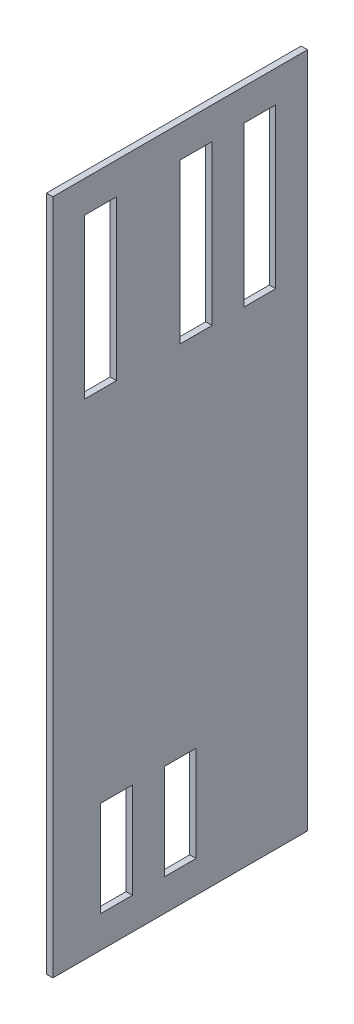
ISO-10303-21;
HEADER;
FILE_DESCRIPTION(('STEP AP214'),'2;1');
FILE_NAME('part.step','',(''),(''),'','','');
FILE_SCHEMA(('AUTOMOTIVE_DESIGN { 1 0 10303 214 1 1 1 1 }'));
ENDSEC;
DATA;
#1=APPLICATION_CONTEXT('core data for automotive mechanical design processes');
#2=APPLICATION_PROTOCOL_DEFINITION('international standard','automotive_design',2000,#1);
#3=PRODUCT_CONTEXT('',#1,'mechanical');
#4=PRODUCT('Part','Part','',(#3));
#5=PRODUCT_RELATED_PRODUCT_CATEGORY('part','',(#4));
#6=PRODUCT_DEFINITION_FORMATION('','',#4);
#7=PRODUCT_DEFINITION_CONTEXT('part definition',#1,'design');
#8=PRODUCT_DEFINITION('design','',#6,#7);
#9=PRODUCT_DEFINITION_SHAPE('','',#8);
#10=(LENGTH_UNIT() NAMED_UNIT(*) SI_UNIT(.MILLI.,.METRE.));
#11=(NAMED_UNIT(*) PLANE_ANGLE_UNIT() SI_UNIT($,.RADIAN.));
#12=(NAMED_UNIT(*) SI_UNIT($,.STERADIAN.) SOLID_ANGLE_UNIT());
#13=UNCERTAINTY_MEASURE_WITH_UNIT(LENGTH_MEASURE(1.E-05),#10,'distance_accuracy_value','');
#14=(GEOMETRIC_REPRESENTATION_CONTEXT(3) GLOBAL_UNCERTAINTY_ASSIGNED_CONTEXT((#13)) GLOBAL_UNIT_ASSIGNED_CONTEXT((#10,
#11,#12)) REPRESENTATION_CONTEXT('',''));
#15=CARTESIAN_POINT('',(0.,0.,0.));
#16=DIRECTION('',(0.,0.,1.));
#17=DIRECTION('',(1.,0.,0.));
#18=AXIS2_PLACEMENT_3D('',#15,#16,#17);
#19=CARTESIAN_POINT('',(-2.,0.,0.));
#20=DIRECTION('',(0.,0.,-1.));
#21=DIRECTION('',(-1.,0.,0.));
#22=AXIS2_PLACEMENT_3D('',#19,#20,#21);
#23=PLANE('',#22);
#24=DIRECTION('',(0.,1.,0.));
#25=VECTOR('',#24,1.);
#26=CARTESIAN_POINT('',(0.,0.,0.));
#27=LINE('',#26,#25);
#28=CARTESIAN_POINT('',(0.,0.,0.));
#29=VERTEX_POINT('',#28);
#30=CARTESIAN_POINT('',(0.,212.4467896,0.));
#31=VERTEX_POINT('',#30);
#32=EDGE_CURVE('E355',#29,#31,#27,.T.);
#33=ORIENTED_EDGE('',*,*,#32,.F.);
#34=DIRECTION('',(1.,0.,0.));
#35=VECTOR('',#34,1.);
#36=CARTESIAN_POINT('',(-2.,0.,0.));
#37=LINE('',#36,#35);
#38=CARTESIAN_POINT('',(-2.,0.,0.));
#39=VERTEX_POINT('',#38);
#40=EDGE_CURVE('E11',#39,#29,#37,.T.);
#41=ORIENTED_EDGE('',*,*,#40,.F.);
#42=DIRECTION('',(0.,1.,0.));
#43=VECTOR('',#42,1.);
#44=CARTESIAN_POINT('',(-2.,0.,0.));
#45=LINE('',#44,#43);
#46=CARTESIAN_POINT('',(-2.,212.4467896,0.));
#47=VERTEX_POINT('',#46);
#48=EDGE_CURVE('E362',#39,#47,#45,.T.);
#49=ORIENTED_EDGE('',*,*,#48,.T.);
#50=DIRECTION('',(1.,0.,0.));
#51=VECTOR('',#50,1.);
#52=CARTESIAN_POINT('',(-2.,212.4467896,0.));
#53=LINE('',#52,#51);
#54=EDGE_CURVE('E39',#47,#31,#53,.T.);
#55=ORIENTED_EDGE('',*,*,#54,.T.);
#56=EDGE_LOOP('',(#33,#41,#49,#55));
#57=FACE_BOUND('',#56,.T.);
#58=ADVANCED_FACE('F36',(#57),#23,.T.);
#59=CARTESIAN_POINT('',(-2.,0.,0.));
#60=DIRECTION('',(0.,-1.,0.));
#61=DIRECTION('',(0.,0.,-1.));
#62=AXIS2_PLACEMENT_3D('',#59,#60,#61);
#63=PLANE('',#62);
#64=DIRECTION('',(0.,0.,-1.));
#65=VECTOR('',#64,1.);
#66=CARTESIAN_POINT('',(0.,0.,0.));
#67=LINE('',#66,#65);
#68=CARTESIAN_POINT('',(0.,0.,80.));
#69=VERTEX_POINT('',#68);
#70=EDGE_CURVE('E366',#69,#29,#67,.T.);
#71=ORIENTED_EDGE('',*,*,#70,.F.);
#72=DIRECTION('',(1.,0.,0.));
#73=VECTOR('',#72,1.);
#74=CARTESIAN_POINT('',(-2.,0.,80.));
#75=LINE('',#74,#73);
#76=CARTESIAN_POINT('',(-2.,0.,80.));
#77=VERTEX_POINT('',#76);
#78=EDGE_CURVE('E44',#77,#69,#75,.T.);
#79=ORIENTED_EDGE('',*,*,#78,.F.);
#80=DIRECTION('',(0.,0.,-1.));
#81=VECTOR('',#80,1.);
#82=CARTESIAN_POINT('',(-2.,0.,0.));
#83=LINE('',#82,#81);
#84=EDGE_CURVE('E372',#77,#39,#83,.T.);
#85=ORIENTED_EDGE('',*,*,#84,.T.);
#86=ORIENTED_EDGE('',*,*,#40,.T.);
#87=EDGE_LOOP('',(#71,#79,#85,#86));
#88=FACE_BOUND('',#87,.T.);
#89=ADVANCED_FACE('F398',(#88),#63,.T.);
#90=CARTESIAN_POINT('',(-2.,0.,80.));
#91=DIRECTION('',(0.,0.,1.));
#92=DIRECTION('',(1.,0.,0.));
#93=AXIS2_PLACEMENT_3D('',#90,#91,#92);
#94=PLANE('',#93);
#95=DIRECTION('',(0.,-1.,0.));
#96=VECTOR('',#95,1.);
#97=CARTESIAN_POINT('',(0.,0.,80.));
#98=LINE('',#97,#96);
#99=CARTESIAN_POINT('',(0.,212.4467896,80.));
#100=VERTEX_POINT('',#99);
#101=EDGE_CURVE('E380',#100,#69,#98,.T.);
#102=ORIENTED_EDGE('',*,*,#101,.F.);
#103=DIRECTION('',(1.,0.,0.));
#104=VECTOR('',#103,1.);
#105=CARTESIAN_POINT('',(-2.,212.4467896,80.));
#106=LINE('',#105,#104);
#107=CARTESIAN_POINT('',(-2.,212.4467896,80.));
#108=VERTEX_POINT('',#107);
#109=EDGE_CURVE('E385',#108,#100,#106,.T.);
#110=ORIENTED_EDGE('',*,*,#109,.F.);
#111=DIRECTION('',(0.,-1.,0.));
#112=VECTOR('',#111,1.);
#113=CARTESIAN_POINT('',(-2.,0.,80.));
#114=LINE('',#113,#112);
#115=EDGE_CURVE('E369',#108,#77,#114,.T.);
#116=ORIENTED_EDGE('',*,*,#115,.T.);
#117=ORIENTED_EDGE('',*,*,#78,.T.);
#118=EDGE_LOOP('',(#102,#110,#116,#117));
#119=FACE_BOUND('',#118,.T.);
#120=ADVANCED_FACE('F403',(#119),#94,.T.);
#121=CARTESIAN_POINT('',(-2.,212.4467896,0.));
#122=DIRECTION('',(0.,1.,0.));
#123=DIRECTION('',(0.,0.,1.));
#124=AXIS2_PLACEMENT_3D('',#121,#122,#123);
#125=PLANE('',#124);
#126=DIRECTION('',(0.,0.,1.));
#127=VECTOR('',#126,1.);
#128=CARTESIAN_POINT('',(0.,212.4467896,0.));
#129=LINE('',#128,#127);
#130=EDGE_CURVE('E377',#31,#100,#129,.T.);
#131=ORIENTED_EDGE('',*,*,#130,.F.);
#132=ORIENTED_EDGE('',*,*,#54,.F.);
#133=DIRECTION('',(0.,0.,1.));
#134=VECTOR('',#133,1.);
#135=CARTESIAN_POINT('',(-2.,212.4467896,0.));
#136=LINE('',#135,#134);
#137=EDGE_CURVE('E365',#47,#108,#136,.T.);
#138=ORIENTED_EDGE('',*,*,#137,.T.);
#139=ORIENTED_EDGE('',*,*,#109,.T.);
#140=EDGE_LOOP('',(#131,#132,#138,#139));
#141=FACE_BOUND('',#140,.T.);
#142=ADVANCED_FACE('F393',(#141),#125,.T.);
#143=CARTESIAN_POINT('',(-2.,0.,0.));
#144=DIRECTION('',(1.,0.,0.));
#145=DIRECTION('',(0.,0.,-1.));
#146=AXIS2_PLACEMENT_3D('',#143,#144,#145);
#147=PLANE('',#146);
#148=DIRECTION('',(0.,0.,1.));
#149=VECTOR('',#148,1.);
#150=CARTESIAN_POINT('',(-2.,40.,45.));
#151=LINE('',#150,#149);
#152=CARTESIAN_POINT('',(-2.,40.,35.));
#153=VERTEX_POINT('',#152);
#154=CARTESIAN_POINT('',(-2.,40.,45.));
#155=VERTEX_POINT('',#154);
#156=EDGE_CURVE('E205',#153,#155,#151,.T.);
#157=ORIENTED_EDGE('',*,*,#156,.T.);
#158=DIRECTION('',(0.,-1.,0.));
#159=VECTOR('',#158,1.);
#160=CARTESIAN_POINT('',(-2.,40.,45.));
#161=LINE('',#160,#159);
#162=CARTESIAN_POINT('',(-2.,9.99999999999999,45.));
#163=VERTEX_POINT('',#162);
#164=EDGE_CURVE('E199',#155,#163,#161,.T.);
#165=ORIENTED_EDGE('',*,*,#164,.T.);
#166=DIRECTION('',(0.,0.,-1.));
#167=VECTOR('',#166,1.);
#168=CARTESIAN_POINT('',(-2.,9.99999999999999,45.));
#169=LINE('',#168,#167);
#170=CARTESIAN_POINT('',(-2.,9.99999999999999,35.));
#171=VERTEX_POINT('',#170);
#172=EDGE_CURVE('E208',#163,#171,#169,.T.);
#173=ORIENTED_EDGE('',*,*,#172,.T.);
#174=DIRECTION('',(0.,1.,0.));
#175=VECTOR('',#174,1.);
#176=CARTESIAN_POINT('',(-2.,40.,35.));
#177=LINE('',#176,#175);
#178=EDGE_CURVE('E52',#171,#153,#177,.T.);
#179=ORIENTED_EDGE('',*,*,#178,.T.);
#180=EDGE_LOOP('',(#157,#165,#173,#179));
#181=FACE_BOUND('',#180,.T.);
#182=DIRECTION('',(0.,0.,1.));
#183=VECTOR('',#182,1.);
#184=CARTESIAN_POINT('',(-2.,40.,65.));
#185=LINE('',#184,#183);
#186=CARTESIAN_POINT('',(-2.,40.,55.));
#187=VERTEX_POINT('',#186);
#188=CARTESIAN_POINT('',(-2.,40.,65.));
#189=VERTEX_POINT('',#188);
#190=EDGE_CURVE('E244',#187,#189,#185,.T.);
#191=ORIENTED_EDGE('',*,*,#190,.T.);
#192=DIRECTION('',(0.,-1.,0.));
#193=VECTOR('',#192,1.);
#194=CARTESIAN_POINT('',(-2.,40.,65.));
#195=LINE('',#194,#193);
#196=CARTESIAN_POINT('',(-2.,9.99999999999999,65.));
#197=VERTEX_POINT('',#196);
#198=EDGE_CURVE('E234',#189,#197,#195,.T.);
#199=ORIENTED_EDGE('',*,*,#198,.T.);
#200=DIRECTION('',(0.,0.,-1.));
#201=VECTOR('',#200,1.);
#202=CARTESIAN_POINT('',(-2.,9.99999999999999,65.));
#203=LINE('',#202,#201);
#204=CARTESIAN_POINT('',(-2.,9.99999999999999,55.));
#205=VERTEX_POINT('',#204);
#206=EDGE_CURVE('E237',#197,#205,#203,.T.);
#207=ORIENTED_EDGE('',*,*,#206,.T.);
#208=DIRECTION('',(0.,1.,0.));
#209=VECTOR('',#208,1.);
#210=CARTESIAN_POINT('',(-2.,40.,55.));
#211=LINE('',#210,#209);
#212=EDGE_CURVE('E241',#205,#187,#211,.T.);
#213=ORIENTED_EDGE('',*,*,#212,.T.);
#214=EDGE_LOOP('',(#191,#199,#207,#213));
#215=FACE_BOUND('',#214,.T.);
#216=DIRECTION('',(0.,0.,1.));
#217=VECTOR('',#216,1.);
#218=CARTESIAN_POINT('',(-2.,202.4467896,20.));
#219=LINE('',#218,#217);
#220=CARTESIAN_POINT('',(-2.,202.4467896,10.));
#221=VERTEX_POINT('',#220);
#222=CARTESIAN_POINT('',(-2.,202.4467896,20.));
#223=VERTEX_POINT('',#222);
#224=EDGE_CURVE('E276',#221,#223,#219,.T.);
#225=ORIENTED_EDGE('',*,*,#224,.T.);
#226=DIRECTION('',(0.,-1.,0.));
#227=VECTOR('',#226,1.);
#228=CARTESIAN_POINT('',(-2.,202.4467896,20.));
#229=LINE('',#228,#227);
#230=CARTESIAN_POINT('',(-2.,152.4467896,20.));
#231=VERTEX_POINT('',#230);
#232=EDGE_CURVE('E266',#223,#231,#229,.T.);
#233=ORIENTED_EDGE('',*,*,#232,.T.);
#234=DIRECTION('',(0.,0.,-1.));
#235=VECTOR('',#234,1.);
#236=CARTESIAN_POINT('',(-2.,152.4467896,20.));
#237=LINE('',#236,#235);
#238=CARTESIAN_POINT('',(-2.,152.4467896,10.));
#239=VERTEX_POINT('',#238);
#240=EDGE_CURVE('E269',#231,#239,#237,.T.);
#241=ORIENTED_EDGE('',*,*,#240,.T.);
#242=DIRECTION('',(0.,1.,0.));
#243=VECTOR('',#242,1.);
#244=CARTESIAN_POINT('',(-2.,202.4467896,10.));
#245=LINE('',#244,#243);
#246=EDGE_CURVE('E273',#239,#221,#245,.T.);
#247=ORIENTED_EDGE('',*,*,#246,.T.);
#248=EDGE_LOOP('',(#225,#233,#241,#247));
#249=FACE_BOUND('',#248,.T.);
#250=DIRECTION('',(0.,0.,1.));
#251=VECTOR('',#250,1.);
#252=CARTESIAN_POINT('',(-2.,202.4467896,40.));
#253=LINE('',#252,#251);
#254=CARTESIAN_POINT('',(-2.,202.4467896,30.));
#255=VERTEX_POINT('',#254);
#256=CARTESIAN_POINT('',(-2.,202.4467896,40.));
#257=VERTEX_POINT('',#256);
#258=EDGE_CURVE('E308',#255,#257,#253,.T.);
#259=ORIENTED_EDGE('',*,*,#258,.T.);
#260=DIRECTION('',(0.,-1.,0.));
#261=VECTOR('',#260,1.);
#262=CARTESIAN_POINT('',(-2.,202.4467896,40.));
#263=LINE('',#262,#261);
#264=CARTESIAN_POINT('',(-2.,152.4467896,40.));
#265=VERTEX_POINT('',#264);
#266=EDGE_CURVE('E298',#257,#265,#263,.T.);
#267=ORIENTED_EDGE('',*,*,#266,.T.);
#268=DIRECTION('',(0.,0.,-1.));
#269=VECTOR('',#268,1.);
#270=CARTESIAN_POINT('',(-2.,152.4467896,40.));
#271=LINE('',#270,#269);
#272=CARTESIAN_POINT('',(-2.,152.4467896,30.));
#273=VERTEX_POINT('',#272);
#274=EDGE_CURVE('E301',#265,#273,#271,.T.);
#275=ORIENTED_EDGE('',*,*,#274,.T.);
#276=DIRECTION('',(0.,1.,0.));
#277=VECTOR('',#276,1.);
#278=CARTESIAN_POINT('',(-2.,202.4467896,30.));
#279=LINE('',#278,#277);
#280=EDGE_CURVE('E305',#273,#255,#279,.T.);
#281=ORIENTED_EDGE('',*,*,#280,.T.);
#282=EDGE_LOOP('',(#259,#267,#275,#281));
#283=FACE_BOUND('',#282,.T.);
#284=DIRECTION('',(0.,0.,1.));
#285=VECTOR('',#284,1.);
#286=CARTESIAN_POINT('',(-2.,202.4467896,70.));
#287=LINE('',#286,#285);
#288=CARTESIAN_POINT('',(-2.,202.4467896,60.));
#289=VERTEX_POINT('',#288);
#290=CARTESIAN_POINT('',(-2.,202.4467896,70.));
#291=VERTEX_POINT('',#290);
#292=EDGE_CURVE('E340',#289,#291,#287,.T.);
#293=ORIENTED_EDGE('',*,*,#292,.T.);
#294=DIRECTION('',(0.,-1.,0.));
#295=VECTOR('',#294,1.);
#296=CARTESIAN_POINT('',(-2.,202.4467896,70.));
#297=LINE('',#296,#295);
#298=CARTESIAN_POINT('',(-2.,152.4467896,70.));
#299=VERTEX_POINT('',#298);
#300=EDGE_CURVE('E330',#291,#299,#297,.T.);
#301=ORIENTED_EDGE('',*,*,#300,.T.);
#302=DIRECTION('',(0.,0.,-1.));
#303=VECTOR('',#302,1.);
#304=CARTESIAN_POINT('',(-2.,152.4467896,70.));
#305=LINE('',#304,#303);
#306=CARTESIAN_POINT('',(-2.,152.4467896,60.));
#307=VERTEX_POINT('',#306);
#308=EDGE_CURVE('E333',#299,#307,#305,.T.);
#309=ORIENTED_EDGE('',*,*,#308,.T.);
#310=DIRECTION('',(0.,1.,0.));
#311=VECTOR('',#310,1.);
#312=CARTESIAN_POINT('',(-2.,202.4467896,60.));
#313=LINE('',#312,#311);
#314=EDGE_CURVE('E337',#307,#289,#313,.T.);
#315=ORIENTED_EDGE('',*,*,#314,.T.);
#316=EDGE_LOOP('',(#293,#301,#309,#315));
#317=FACE_BOUND('',#316,.T.);
#318=ORIENTED_EDGE('',*,*,#48,.F.);
#319=ORIENTED_EDGE('',*,*,#84,.F.);
#320=ORIENTED_EDGE('',*,*,#115,.F.);
#321=ORIENTED_EDGE('',*,*,#137,.F.);
#322=EDGE_LOOP('',(#318,#319,#320,#321));
#323=FACE_BOUND('',#322,.T.);
#324=ADVANCED_FACE('F212',(#181,#215,#249,#283,#317,#323),#147,.F.);
#325=CARTESIAN_POINT('',(0.,0.,0.));
#326=DIRECTION('',(1.,0.,0.));
#327=DIRECTION('',(0.,0.,-1.));
#328=AXIS2_PLACEMENT_3D('',#325,#326,#327);
#329=PLANE('',#328);
#330=DIRECTION('',(0.,-1.,0.));
#331=VECTOR('',#330,1.);
#332=CARTESIAN_POINT('',(0.,40.,45.));
#333=LINE('',#332,#331);
#334=CARTESIAN_POINT('',(0.,40.,45.));
#335=VERTEX_POINT('',#334);
#336=CARTESIAN_POINT('',(0.,9.99999999999999,45.));
#337=VERTEX_POINT('',#336);
#338=EDGE_CURVE('E60',#335,#337,#333,.T.);
#339=ORIENTED_EDGE('',*,*,#338,.F.);
#340=DIRECTION('',(0.,0.,1.));
#341=VECTOR('',#340,1.);
#342=CARTESIAN_POINT('',(0.,40.,45.));
#343=LINE('',#342,#341);
#344=CARTESIAN_POINT('',(0.,40.,35.));
#345=VERTEX_POINT('',#344);
#346=EDGE_CURVE('E215',#345,#335,#343,.T.);
#347=ORIENTED_EDGE('',*,*,#346,.F.);
#348=DIRECTION('',(0.,1.,0.));
#349=VECTOR('',#348,1.);
#350=CARTESIAN_POINT('',(0.,40.,35.));
#351=LINE('',#350,#349);
#352=CARTESIAN_POINT('',(0.,9.99999999999999,35.));
#353=VERTEX_POINT('',#352);
#354=EDGE_CURVE('E218',#353,#345,#351,.T.);
#355=ORIENTED_EDGE('',*,*,#354,.F.);
#356=DIRECTION('',(0.,0.,-1.));
#357=VECTOR('',#356,1.);
#358=CARTESIAN_POINT('',(0.,9.99999999999999,45.));
#359=LINE('',#358,#357);
#360=EDGE_CURVE('E224',#337,#353,#359,.T.);
#361=ORIENTED_EDGE('',*,*,#360,.F.);
#362=EDGE_LOOP('',(#339,#347,#355,#361));
#363=FACE_BOUND('',#362,.T.);
#364=DIRECTION('',(0.,-1.,0.));
#365=VECTOR('',#364,1.);
#366=CARTESIAN_POINT('',(0.,40.,65.));
#367=LINE('',#366,#365);
#368=CARTESIAN_POINT('',(0.,40.,65.));
#369=VERTEX_POINT('',#368);
#370=CARTESIAN_POINT('',(0.,9.99999999999999,65.));
#371=VERTEX_POINT('',#370);
#372=EDGE_CURVE('E230',#369,#371,#367,.T.);
#373=ORIENTED_EDGE('',*,*,#372,.F.);
#374=DIRECTION('',(0.,0.,1.));
#375=VECTOR('',#374,1.);
#376=CARTESIAN_POINT('',(0.,40.,65.));
#377=LINE('',#376,#375);
#378=CARTESIAN_POINT('',(0.,40.,55.));
#379=VERTEX_POINT('',#378);
#380=EDGE_CURVE('E238',#379,#369,#377,.T.);
#381=ORIENTED_EDGE('',*,*,#380,.F.);
#382=DIRECTION('',(0.,1.,0.));
#383=VECTOR('',#382,1.);
#384=CARTESIAN_POINT('',(0.,40.,55.));
#385=LINE('',#384,#383);
#386=CARTESIAN_POINT('',(0.,9.99999999999999,55.));
#387=VERTEX_POINT('',#386);
#388=EDGE_CURVE('E252',#387,#379,#385,.T.);
#389=ORIENTED_EDGE('',*,*,#388,.F.);
#390=DIRECTION('',(0.,0.,-1.));
#391=VECTOR('',#390,1.);
#392=CARTESIAN_POINT('',(0.,9.99999999999999,65.));
#393=LINE('',#392,#391);
#394=EDGE_CURVE('E249',#371,#387,#393,.T.);
#395=ORIENTED_EDGE('',*,*,#394,.F.);
#396=EDGE_LOOP('',(#373,#381,#389,#395));
#397=FACE_BOUND('',#396,.T.);
#398=DIRECTION('',(0.,-1.,0.));
#399=VECTOR('',#398,1.);
#400=CARTESIAN_POINT('',(0.,202.4467896,20.));
#401=LINE('',#400,#399);
#402=CARTESIAN_POINT('',(0.,202.4467896,20.));
#403=VERTEX_POINT('',#402);
#404=CARTESIAN_POINT('',(0.,152.4467896,20.));
#405=VERTEX_POINT('',#404);
#406=EDGE_CURVE('E259',#403,#405,#401,.T.);
#407=ORIENTED_EDGE('',*,*,#406,.F.);
#408=DIRECTION('',(0.,0.,1.));
#409=VECTOR('',#408,1.);
#410=CARTESIAN_POINT('',(0.,202.4467896,20.));
#411=LINE('',#410,#409);
#412=CARTESIAN_POINT('',(0.,202.4467896,10.));
#413=VERTEX_POINT('',#412);
#414=EDGE_CURVE('E270',#413,#403,#411,.T.);
#415=ORIENTED_EDGE('',*,*,#414,.F.);
#416=DIRECTION('',(0.,1.,0.));
#417=VECTOR('',#416,1.);
#418=CARTESIAN_POINT('',(0.,202.4467896,10.));
#419=LINE('',#418,#417);
#420=CARTESIAN_POINT('',(0.,152.4467896,10.));
#421=VERTEX_POINT('',#420);
#422=EDGE_CURVE('E284',#421,#413,#419,.T.);
#423=ORIENTED_EDGE('',*,*,#422,.F.);
#424=DIRECTION('',(0.,0.,-1.));
#425=VECTOR('',#424,1.);
#426=CARTESIAN_POINT('',(0.,152.4467896,20.));
#427=LINE('',#426,#425);
#428=EDGE_CURVE('E281',#405,#421,#427,.T.);
#429=ORIENTED_EDGE('',*,*,#428,.F.);
#430=EDGE_LOOP('',(#407,#415,#423,#429));
#431=FACE_BOUND('',#430,.T.);
#432=DIRECTION('',(0.,-1.,0.));
#433=VECTOR('',#432,1.);
#434=CARTESIAN_POINT('',(0.,202.4467896,40.));
#435=LINE('',#434,#433);
#436=CARTESIAN_POINT('',(0.,202.4467896,40.));
#437=VERTEX_POINT('',#436);
#438=CARTESIAN_POINT('',(0.,152.4467896,40.));
#439=VERTEX_POINT('',#438);
#440=EDGE_CURVE('E291',#437,#439,#435,.T.);
#441=ORIENTED_EDGE('',*,*,#440,.F.);
#442=DIRECTION('',(0.,0.,1.));
#443=VECTOR('',#442,1.);
#444=CARTESIAN_POINT('',(0.,202.4467896,40.));
#445=LINE('',#444,#443);
#446=CARTESIAN_POINT('',(0.,202.4467896,30.));
#447=VERTEX_POINT('',#446);
#448=EDGE_CURVE('E302',#447,#437,#445,.T.);
#449=ORIENTED_EDGE('',*,*,#448,.F.);
#450=DIRECTION('',(0.,1.,0.));
#451=VECTOR('',#450,1.);
#452=CARTESIAN_POINT('',(0.,202.4467896,30.));
#453=LINE('',#452,#451);
#454=CARTESIAN_POINT('',(0.,152.4467896,30.));
#455=VERTEX_POINT('',#454);
#456=EDGE_CURVE('E316',#455,#447,#453,.T.);
#457=ORIENTED_EDGE('',*,*,#456,.F.);
#458=DIRECTION('',(0.,0.,-1.));
#459=VECTOR('',#458,1.);
#460=CARTESIAN_POINT('',(0.,152.4467896,40.));
#461=LINE('',#460,#459);
#462=EDGE_CURVE('E313',#439,#455,#461,.T.);
#463=ORIENTED_EDGE('',*,*,#462,.F.);
#464=EDGE_LOOP('',(#441,#449,#457,#463));
#465=FACE_BOUND('',#464,.T.);
#466=DIRECTION('',(0.,-1.,0.));
#467=VECTOR('',#466,1.);
#468=CARTESIAN_POINT('',(0.,202.4467896,70.));
#469=LINE('',#468,#467);
#470=CARTESIAN_POINT('',(0.,202.4467896,70.));
#471=VERTEX_POINT('',#470);
#472=CARTESIAN_POINT('',(0.,152.4467896,70.));
#473=VERTEX_POINT('',#472);
#474=EDGE_CURVE('E323',#471,#473,#469,.T.);
#475=ORIENTED_EDGE('',*,*,#474,.F.);
#476=DIRECTION('',(0.,0.,1.));
#477=VECTOR('',#476,1.);
#478=CARTESIAN_POINT('',(0.,202.4467896,70.));
#479=LINE('',#478,#477);
#480=CARTESIAN_POINT('',(0.,202.4467896,60.));
#481=VERTEX_POINT('',#480);
#482=EDGE_CURVE('E334',#481,#471,#479,.T.);
#483=ORIENTED_EDGE('',*,*,#482,.F.);
#484=DIRECTION('',(0.,1.,0.));
#485=VECTOR('',#484,1.);
#486=CARTESIAN_POINT('',(0.,202.4467896,60.));
#487=LINE('',#486,#485);
#488=CARTESIAN_POINT('',(0.,152.4467896,60.));
#489=VERTEX_POINT('',#488);
#490=EDGE_CURVE('E348',#489,#481,#487,.T.);
#491=ORIENTED_EDGE('',*,*,#490,.F.);
#492=DIRECTION('',(0.,0.,-1.));
#493=VECTOR('',#492,1.);
#494=CARTESIAN_POINT('',(0.,152.4467896,70.));
#495=LINE('',#494,#493);
#496=EDGE_CURVE('E345',#473,#489,#495,.T.);
#497=ORIENTED_EDGE('',*,*,#496,.F.);
#498=EDGE_LOOP('',(#475,#483,#491,#497));
#499=FACE_BOUND('',#498,.T.);
#500=ORIENTED_EDGE('',*,*,#32,.T.);
#501=ORIENTED_EDGE('',*,*,#130,.T.);
#502=ORIENTED_EDGE('',*,*,#101,.T.);
#503=ORIENTED_EDGE('',*,*,#70,.T.);
#504=EDGE_LOOP('',(#500,#501,#502,#503));
#505=FACE_BOUND('',#504,.T.);
#506=ADVANCED_FACE('F395',(#363,#397,#431,#465,#499,#505),#329,.T.);
#507=CARTESIAN_POINT('',(-2.,202.4467896,70.));
#508=DIRECTION('',(0.,0.,1.));
#509=DIRECTION('',(1.,0.,0.));
#510=AXIS2_PLACEMENT_3D('',#507,#508,#509);
#511=PLANE('',#510);
#512=ORIENTED_EDGE('',*,*,#474,.T.);
#513=DIRECTION('',(1.,0.,0.));
#514=VECTOR('',#513,1.);
#515=CARTESIAN_POINT('',(-2.,152.4467896,70.));
#516=LINE('',#515,#514);
#517=EDGE_CURVE('E343',#299,#473,#516,.T.);
#518=ORIENTED_EDGE('',*,*,#517,.F.);
#519=ORIENTED_EDGE('',*,*,#300,.F.);
#520=DIRECTION('',(1.,0.,0.));
#521=VECTOR('',#520,1.);
#522=CARTESIAN_POINT('',(-2.,202.4467896,70.));
#523=LINE('',#522,#521);
#524=EDGE_CURVE('E353',#291,#471,#523,.T.);
#525=ORIENTED_EDGE('',*,*,#524,.T.);
#526=EDGE_LOOP('',(#512,#518,#519,#525));
#527=FACE_BOUND('',#526,.T.);
#528=ADVANCED_FACE('F449',(#527),#511,.F.);
#529=CARTESIAN_POINT('',(-2.,202.4467896,70.));
#530=DIRECTION('',(0.,1.,0.));
#531=DIRECTION('',(0.,0.,1.));
#532=AXIS2_PLACEMENT_3D('',#529,#530,#531);
#533=PLANE('',#532);
#534=ORIENTED_EDGE('',*,*,#482,.T.);
#535=ORIENTED_EDGE('',*,*,#524,.F.);
#536=ORIENTED_EDGE('',*,*,#292,.F.);
#537=DIRECTION('',(1.,0.,0.));
#538=VECTOR('',#537,1.);
#539=CARTESIAN_POINT('',(-2.,202.4467896,60.));
#540=LINE('',#539,#538);
#541=EDGE_CURVE('E356',#289,#481,#540,.T.);
#542=ORIENTED_EDGE('',*,*,#541,.T.);
#543=EDGE_LOOP('',(#534,#535,#536,#542));
#544=FACE_BOUND('',#543,.T.);
#545=ADVANCED_FACE('F460',(#544),#533,.F.);
#546=CARTESIAN_POINT('',(-2.,202.4467896,60.));
#547=DIRECTION('',(0.,0.,-1.));
#548=DIRECTION('',(0.,1.,0.));
#549=AXIS2_PLACEMENT_3D('',#546,#547,#548);
#550=PLANE('',#549);
#551=ORIENTED_EDGE('',*,*,#490,.T.);
#552=ORIENTED_EDGE('',*,*,#541,.F.);
#553=ORIENTED_EDGE('',*,*,#314,.F.);
#554=DIRECTION('',(1.,0.,0.));
#555=VECTOR('',#554,1.);
#556=CARTESIAN_POINT('',(-2.,152.4467896,60.));
#557=LINE('',#556,#555);
#558=EDGE_CURVE('E358',#307,#489,#557,.T.);
#559=ORIENTED_EDGE('',*,*,#558,.T.);
#560=EDGE_LOOP('',(#551,#552,#553,#559));
#561=FACE_BOUND('',#560,.T.);
#562=ADVANCED_FACE('F471',(#561),#550,.F.);
#563=CARTESIAN_POINT('',(-2.,152.4467896,70.));
#564=DIRECTION('',(0.,-1.,0.));
#565=DIRECTION('',(0.,0.,-1.));
#566=AXIS2_PLACEMENT_3D('',#563,#564,#565);
#567=PLANE('',#566);
#568=ORIENTED_EDGE('',*,*,#496,.T.);
#569=ORIENTED_EDGE('',*,*,#558,.F.);
#570=ORIENTED_EDGE('',*,*,#308,.F.);
#571=ORIENTED_EDGE('',*,*,#517,.T.);
#572=EDGE_LOOP('',(#568,#569,#570,#571));
#573=FACE_BOUND('',#572,.T.);
#574=ADVANCED_FACE('F482',(#573),#567,.F.);
#575=CARTESIAN_POINT('',(-2.,202.4467896,40.));
#576=DIRECTION('',(0.,0.,1.));
#577=DIRECTION('',(0.,-1.,0.));
#578=AXIS2_PLACEMENT_3D('',#575,#576,#577);
#579=PLANE('',#578);
#580=ORIENTED_EDGE('',*,*,#440,.T.);
#581=DIRECTION('',(1.,0.,0.));
#582=VECTOR('',#581,1.);
#583=CARTESIAN_POINT('',(-2.,152.4467896,40.));
#584=LINE('',#583,#582);
#585=EDGE_CURVE('E311',#265,#439,#584,.T.);
#586=ORIENTED_EDGE('',*,*,#585,.F.);
#587=ORIENTED_EDGE('',*,*,#266,.F.);
#588=DIRECTION('',(1.,0.,0.));
#589=VECTOR('',#588,1.);
#590=CARTESIAN_POINT('',(-2.,202.4467896,40.));
#591=LINE('',#590,#589);
#592=EDGE_CURVE('E321',#257,#437,#591,.T.);
#593=ORIENTED_EDGE('',*,*,#592,.T.);
#594=EDGE_LOOP('',(#580,#586,#587,#593));
#595=FACE_BOUND('',#594,.T.);
#596=ADVANCED_FACE('F493',(#595),#579,.F.);
#597=CARTESIAN_POINT('',(-2.,202.4467896,40.));
#598=DIRECTION('',(0.,1.,0.));
#599=DIRECTION('',(0.,0.,1.));
#600=AXIS2_PLACEMENT_3D('',#597,#598,#599);
#601=PLANE('',#600);
#602=ORIENTED_EDGE('',*,*,#448,.T.);
#603=ORIENTED_EDGE('',*,*,#592,.F.);
#604=ORIENTED_EDGE('',*,*,#258,.F.);
#605=DIRECTION('',(1.,0.,0.));
#606=VECTOR('',#605,1.);
#607=CARTESIAN_POINT('',(-2.,202.4467896,30.));
#608=LINE('',#607,#606);
#609=EDGE_CURVE('E324',#255,#447,#608,.T.);
#610=ORIENTED_EDGE('',*,*,#609,.T.);
#611=EDGE_LOOP('',(#602,#603,#604,#610));
#612=FACE_BOUND('',#611,.T.);
#613=ADVANCED_FACE('F504',(#612),#601,.F.);
#614=CARTESIAN_POINT('',(-2.,202.4467896,30.));
#615=DIRECTION('',(0.,0.,-1.));
#616=DIRECTION('',(0.,1.,0.));
#617=AXIS2_PLACEMENT_3D('',#614,#615,#616);
#618=PLANE('',#617);
#619=ORIENTED_EDGE('',*,*,#456,.T.);
#620=ORIENTED_EDGE('',*,*,#609,.F.);
#621=ORIENTED_EDGE('',*,*,#280,.F.);
#622=DIRECTION('',(1.,0.,0.));
#623=VECTOR('',#622,1.);
#624=CARTESIAN_POINT('',(-2.,152.4467896,30.));
#625=LINE('',#624,#623);
#626=EDGE_CURVE('E326',#273,#455,#625,.T.);
#627=ORIENTED_EDGE('',*,*,#626,.T.);
#628=EDGE_LOOP('',(#619,#620,#621,#627));
#629=FACE_BOUND('',#628,.T.);
#630=ADVANCED_FACE('F515',(#629),#618,.F.);
#631=CARTESIAN_POINT('',(-2.,152.4467896,40.));
#632=DIRECTION('',(0.,-1.,0.));
#633=DIRECTION('',(0.,0.,-1.));
#634=AXIS2_PLACEMENT_3D('',#631,#632,#633);
#635=PLANE('',#634);
#636=ORIENTED_EDGE('',*,*,#462,.T.);
#637=ORIENTED_EDGE('',*,*,#626,.F.);
#638=ORIENTED_EDGE('',*,*,#274,.F.);
#639=ORIENTED_EDGE('',*,*,#585,.T.);
#640=EDGE_LOOP('',(#636,#637,#638,#639));
#641=FACE_BOUND('',#640,.T.);
#642=ADVANCED_FACE('F526',(#641),#635,.F.);
#643=CARTESIAN_POINT('',(-2.,202.4467896,20.));
#644=DIRECTION('',(0.,0.,1.));
#645=DIRECTION('',(0.,-1.,0.));
#646=AXIS2_PLACEMENT_3D('',#643,#644,#645);
#647=PLANE('',#646);
#648=ORIENTED_EDGE('',*,*,#406,.T.);
#649=DIRECTION('',(1.,0.,0.));
#650=VECTOR('',#649,1.);
#651=CARTESIAN_POINT('',(-2.,152.4467896,20.));
#652=LINE('',#651,#650);
#653=EDGE_CURVE('E279',#231,#405,#652,.T.);
#654=ORIENTED_EDGE('',*,*,#653,.F.);
#655=ORIENTED_EDGE('',*,*,#232,.F.);
#656=DIRECTION('',(1.,0.,0.));
#657=VECTOR('',#656,1.);
#658=CARTESIAN_POINT('',(-2.,202.4467896,20.));
#659=LINE('',#658,#657);
#660=EDGE_CURVE('E289',#223,#403,#659,.T.);
#661=ORIENTED_EDGE('',*,*,#660,.T.);
#662=EDGE_LOOP('',(#648,#654,#655,#661));
#663=FACE_BOUND('',#662,.T.);
#664=ADVANCED_FACE('F537',(#663),#647,.F.);
#665=CARTESIAN_POINT('',(-2.,202.4467896,20.));
#666=DIRECTION('',(0.,1.,0.));
#667=DIRECTION('',(0.,0.,1.));
#668=AXIS2_PLACEMENT_3D('',#665,#666,#667);
#669=PLANE('',#668);
#670=ORIENTED_EDGE('',*,*,#414,.T.);
#671=ORIENTED_EDGE('',*,*,#660,.F.);
#672=ORIENTED_EDGE('',*,*,#224,.F.);
#673=DIRECTION('',(1.,0.,0.));
#674=VECTOR('',#673,1.);
#675=CARTESIAN_POINT('',(-2.,202.4467896,10.));
#676=LINE('',#675,#674);
#677=EDGE_CURVE('E292',#221,#413,#676,.T.);
#678=ORIENTED_EDGE('',*,*,#677,.T.);
#679=EDGE_LOOP('',(#670,#671,#672,#678));
#680=FACE_BOUND('',#679,.T.);
#681=ADVANCED_FACE('F548',(#680),#669,.F.);
#682=CARTESIAN_POINT('',(-2.,202.4467896,10.));
#683=DIRECTION('',(0.,0.,-1.));
#684=DIRECTION('',(0.,1.,0.));
#685=AXIS2_PLACEMENT_3D('',#682,#683,#684);
#686=PLANE('',#685);
#687=ORIENTED_EDGE('',*,*,#422,.T.);
#688=ORIENTED_EDGE('',*,*,#677,.F.);
#689=ORIENTED_EDGE('',*,*,#246,.F.);
#690=DIRECTION('',(1.,0.,0.));
#691=VECTOR('',#690,1.);
#692=CARTESIAN_POINT('',(-2.,152.4467896,10.));
#693=LINE('',#692,#691);
#694=EDGE_CURVE('E294',#239,#421,#693,.T.);
#695=ORIENTED_EDGE('',*,*,#694,.T.);
#696=EDGE_LOOP('',(#687,#688,#689,#695));
#697=FACE_BOUND('',#696,.T.);
#698=ADVANCED_FACE('F559',(#697),#686,.F.);
#699=CARTESIAN_POINT('',(-2.,152.4467896,20.));
#700=DIRECTION('',(0.,-1.,0.));
#701=DIRECTION('',(0.,0.,-1.));
#702=AXIS2_PLACEMENT_3D('',#699,#700,#701);
#703=PLANE('',#702);
#704=ORIENTED_EDGE('',*,*,#428,.T.);
#705=ORIENTED_EDGE('',*,*,#694,.F.);
#706=ORIENTED_EDGE('',*,*,#240,.F.);
#707=ORIENTED_EDGE('',*,*,#653,.T.);
#708=EDGE_LOOP('',(#704,#705,#706,#707));
#709=FACE_BOUND('',#708,.T.);
#710=ADVANCED_FACE('F570',(#709),#703,.F.);
#711=CARTESIAN_POINT('',(-2.,40.,65.));
#712=DIRECTION('',(0.,0.,1.));
#713=DIRECTION('',(1.,0.,0.));
#714=AXIS2_PLACEMENT_3D('',#711,#712,#713);
#715=PLANE('',#714);
#716=ORIENTED_EDGE('',*,*,#372,.T.);
#717=DIRECTION('',(1.,0.,0.));
#718=VECTOR('',#717,1.);
#719=CARTESIAN_POINT('',(-2.,9.99999999999999,65.));
#720=LINE('',#719,#718);
#721=EDGE_CURVE('E247',#197,#371,#720,.T.);
#722=ORIENTED_EDGE('',*,*,#721,.F.);
#723=ORIENTED_EDGE('',*,*,#198,.F.);
#724=DIRECTION('',(1.,0.,0.));
#725=VECTOR('',#724,1.);
#726=CARTESIAN_POINT('',(-2.,40.,65.));
#727=LINE('',#726,#725);
#728=EDGE_CURVE('E257',#189,#369,#727,.T.);
#729=ORIENTED_EDGE('',*,*,#728,.T.);
#730=EDGE_LOOP('',(#716,#722,#723,#729));
#731=FACE_BOUND('',#730,.T.);
#732=ADVANCED_FACE('F581',(#731),#715,.F.);
#733=CARTESIAN_POINT('',(-2.,40.,65.));
#734=DIRECTION('',(0.,1.,0.));
#735=DIRECTION('',(0.,0.,1.));
#736=AXIS2_PLACEMENT_3D('',#733,#734,#735);
#737=PLANE('',#736);
#738=ORIENTED_EDGE('',*,*,#380,.T.);
#739=ORIENTED_EDGE('',*,*,#728,.F.);
#740=ORIENTED_EDGE('',*,*,#190,.F.);
#741=DIRECTION('',(1.,0.,0.));
#742=VECTOR('',#741,1.);
#743=CARTESIAN_POINT('',(-2.,40.,55.));
#744=LINE('',#743,#742);
#745=EDGE_CURVE('E260',#187,#379,#744,.T.);
#746=ORIENTED_EDGE('',*,*,#745,.T.);
#747=EDGE_LOOP('',(#738,#739,#740,#746));
#748=FACE_BOUND('',#747,.T.);
#749=ADVANCED_FACE('F592',(#748),#737,.F.);
#750=CARTESIAN_POINT('',(-2.,40.,55.));
#751=DIRECTION('',(0.,0.,-1.));
#752=DIRECTION('',(0.,1.,0.));
#753=AXIS2_PLACEMENT_3D('',#750,#751,#752);
#754=PLANE('',#753);
#755=ORIENTED_EDGE('',*,*,#388,.T.);
#756=ORIENTED_EDGE('',*,*,#745,.F.);
#757=ORIENTED_EDGE('',*,*,#212,.F.);
#758=DIRECTION('',(1.,0.,0.));
#759=VECTOR('',#758,1.);
#760=CARTESIAN_POINT('',(-2.,9.99999999999999,55.));
#761=LINE('',#760,#759);
#762=EDGE_CURVE('E262',#205,#387,#761,.T.);
#763=ORIENTED_EDGE('',*,*,#762,.T.);
#764=EDGE_LOOP('',(#755,#756,#757,#763));
#765=FACE_BOUND('',#764,.T.);
#766=ADVANCED_FACE('F603',(#765),#754,.F.);
#767=CARTESIAN_POINT('',(-2.,9.99999999999999,65.));
#768=DIRECTION('',(0.,-1.,0.));
#769=DIRECTION('',(0.,0.,-1.));
#770=AXIS2_PLACEMENT_3D('',#767,#768,#769);
#771=PLANE('',#770);
#772=ORIENTED_EDGE('',*,*,#394,.T.);
#773=ORIENTED_EDGE('',*,*,#762,.F.);
#774=ORIENTED_EDGE('',*,*,#206,.F.);
#775=ORIENTED_EDGE('',*,*,#721,.T.);
#776=EDGE_LOOP('',(#772,#773,#774,#775));
#777=FACE_BOUND('',#776,.T.);
#778=ADVANCED_FACE('F614',(#777),#771,.F.);
#779=CARTESIAN_POINT('',(-2.,40.,45.));
#780=DIRECTION('',(0.,0.,1.));
#781=DIRECTION('',(0.,-1.,0.));
#782=AXIS2_PLACEMENT_3D('',#779,#780,#781);
#783=PLANE('',#782);
#784=ORIENTED_EDGE('',*,*,#338,.T.);
#785=DIRECTION('',(1.,0.,0.));
#786=VECTOR('',#785,1.);
#787=CARTESIAN_POINT('',(-2.,9.99999999999999,45.));
#788=LINE('',#787,#786);
#789=EDGE_CURVE('E195',#163,#337,#788,.T.);
#790=ORIENTED_EDGE('',*,*,#789,.F.);
#791=ORIENTED_EDGE('',*,*,#164,.F.);
#792=DIRECTION('',(1.,0.,0.));
#793=VECTOR('',#792,1.);
#794=CARTESIAN_POINT('',(-2.,40.,45.));
#795=LINE('',#794,#793);
#796=EDGE_CURVE('E228',#155,#335,#795,.T.);
#797=ORIENTED_EDGE('',*,*,#796,.T.);
#798=EDGE_LOOP('',(#784,#790,#791,#797));
#799=FACE_BOUND('',#798,.T.);
#800=ADVANCED_FACE('F197',(#799),#783,.F.);
#801=CARTESIAN_POINT('',(-2.,40.,45.));
#802=DIRECTION('',(0.,1.,0.));
#803=DIRECTION('',(0.,0.,1.));
#804=AXIS2_PLACEMENT_3D('',#801,#802,#803);
#805=PLANE('',#804);
#806=ORIENTED_EDGE('',*,*,#346,.T.);
#807=ORIENTED_EDGE('',*,*,#796,.F.);
#808=ORIENTED_EDGE('',*,*,#156,.F.);
#809=DIRECTION('',(1.,0.,0.));
#810=VECTOR('',#809,1.);
#811=CARTESIAN_POINT('',(-2.,40.,35.));
#812=LINE('',#811,#810);
#813=EDGE_CURVE('E231',#153,#345,#812,.T.);
#814=ORIENTED_EDGE('',*,*,#813,.T.);
#815=EDGE_LOOP('',(#806,#807,#808,#814));
#816=FACE_BOUND('',#815,.T.);
#817=ADVANCED_FACE('F635',(#816),#805,.F.);
#818=CARTESIAN_POINT('',(-2.,40.,35.));
#819=DIRECTION('',(0.,0.,-1.));
#820=DIRECTION('',(0.,1.,0.));
#821=AXIS2_PLACEMENT_3D('',#818,#819,#820);
#822=PLANE('',#821);
#823=ORIENTED_EDGE('',*,*,#354,.T.);
#824=ORIENTED_EDGE('',*,*,#813,.F.);
#825=ORIENTED_EDGE('',*,*,#178,.F.);
#826=DIRECTION('',(1.,0.,0.));
#827=VECTOR('',#826,1.);
#828=CARTESIAN_POINT('',(-2.,9.99999999999999,35.));
#829=LINE('',#828,#827);
#830=EDGE_CURVE('E204',#171,#353,#829,.T.);
#831=ORIENTED_EDGE('',*,*,#830,.T.);
#832=EDGE_LOOP('',(#823,#824,#825,#831));
#833=FACE_BOUND('',#832,.T.);
#834=ADVANCED_FACE('F645',(#833),#822,.F.);
#835=CARTESIAN_POINT('',(-2.,9.99999999999999,45.));
#836=DIRECTION('',(0.,-1.,0.));
#837=DIRECTION('',(0.,0.,-1.));
#838=AXIS2_PLACEMENT_3D('',#835,#836,#837);
#839=PLANE('',#838);
#840=ORIENTED_EDGE('',*,*,#360,.T.);
#841=ORIENTED_EDGE('',*,*,#830,.F.);
#842=ORIENTED_EDGE('',*,*,#172,.F.);
#843=ORIENTED_EDGE('',*,*,#789,.T.);
#844=EDGE_LOOP('',(#840,#841,#842,#843));
#845=FACE_BOUND('',#844,.T.);
#846=ADVANCED_FACE('F209',(#845),#839,.F.);
#847=CLOSED_SHELL('',(#58,#89,#120,#142,#324,#506,#528,#545,#562,#574,#596,#613,#630,#642,#664,
#681,#698,#710,#732,#749,#766,#778,#800,#817,#834,#846));
#848=MANIFOLD_SOLID_BREP('B2',#847);
#849=ADVANCED_BREP_SHAPE_REPRESENTATION('',(#18,#848),#14);
#850=SHAPE_DEFINITION_REPRESENTATION(#9,#849);
ENDSEC;
END-ISO-10303-21;
